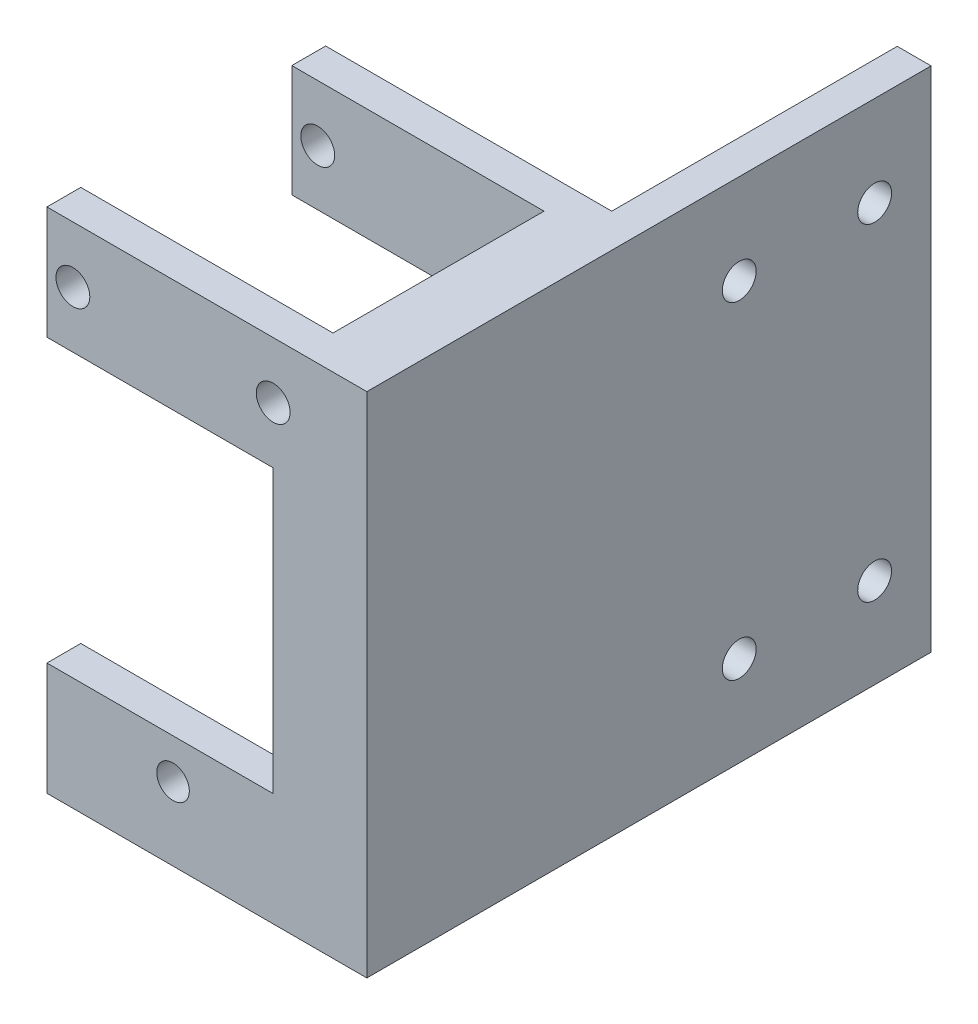
ISO-10303-21;
HEADER;
FILE_DESCRIPTION(('STEP AP214'),'2;1');
FILE_NAME('part.step','',(''),(''),'','','');
FILE_SCHEMA(('AUTOMOTIVE_DESIGN { 1 0 10303 214 1 1 1 1 }'));
ENDSEC;
DATA;
#1=APPLICATION_CONTEXT('core data for automotive mechanical design processes');
#2=APPLICATION_PROTOCOL_DEFINITION('international standard','automotive_design',2000,#1);
#3=PRODUCT_CONTEXT('',#1,'mechanical');
#4=PRODUCT('Part','Part','',(#3));
#5=PRODUCT_RELATED_PRODUCT_CATEGORY('part','',(#4));
#6=PRODUCT_DEFINITION_FORMATION('','',#4);
#7=PRODUCT_DEFINITION_CONTEXT('part definition',#1,'design');
#8=PRODUCT_DEFINITION('design','',#6,#7);
#9=PRODUCT_DEFINITION_SHAPE('','',#8);
#10=(LENGTH_UNIT() NAMED_UNIT(*) SI_UNIT(.MILLI.,.METRE.));
#11=(NAMED_UNIT(*) PLANE_ANGLE_UNIT() SI_UNIT($,.RADIAN.));
#12=(NAMED_UNIT(*) SI_UNIT($,.STERADIAN.) SOLID_ANGLE_UNIT());
#13=UNCERTAINTY_MEASURE_WITH_UNIT(LENGTH_MEASURE(1.E-05),#10,'distance_accuracy_value','');
#14=(GEOMETRIC_REPRESENTATION_CONTEXT(3) GLOBAL_UNCERTAINTY_ASSIGNED_CONTEXT((#13)) GLOBAL_UNIT_ASSIGNED_CONTEXT((#10,
#11,#12)) REPRESENTATION_CONTEXT('',''));
#15=CARTESIAN_POINT('',(0.,0.,0.));
#16=DIRECTION('',(0.,0.,1.));
#17=DIRECTION('',(1.,0.,0.));
#18=AXIS2_PLACEMENT_3D('',#15,#16,#17);
#19=CARTESIAN_POINT('',(0.,-22.5,-3.));
#20=DIRECTION('',(0.,1.,0.));
#21=DIRECTION('',(-1.,0.,0.));
#22=AXIS2_PLACEMENT_3D('',#19,#20,#21);
#23=PLANE('',#22);
#24=DIRECTION('',(0.,0.,1.));
#25=VECTOR('',#24,1.);
#26=CARTESIAN_POINT('',(9.675,-22.5,-21.7));
#27=LINE('',#26,#25);
#28=CARTESIAN_POINT('',(9.675,-22.5,-21.7));
#29=VERTEX_POINT('',#28);
#30=CARTESIAN_POINT('',(9.675,-22.5,-3.));
#31=VERTEX_POINT('',#30);
#32=EDGE_CURVE('E64',#29,#31,#27,.T.);
#33=ORIENTED_EDGE('',*,*,#32,.F.);
#34=DIRECTION('',(1.,0.,0.));
#35=VECTOR('',#34,1.);
#36=CARTESIAN_POINT('',(15.675,-22.5,-21.7));
#37=LINE('',#36,#35);
#38=CARTESIAN_POINT('',(-12.675,-22.5,-21.7));
#39=VERTEX_POINT('',#38);
#40=EDGE_CURVE('E176',#39,#29,#37,.T.);
#41=ORIENTED_EDGE('',*,*,#40,.F.);
#42=DIRECTION('',(0.,0.,1.));
#43=VECTOR('',#42,1.);
#44=CARTESIAN_POINT('',(-12.675,-22.5,-26.7));
#45=LINE('',#44,#43);
#46=CARTESIAN_POINT('',(-12.675,-22.5,-24.7));
#47=VERTEX_POINT('',#46);
#48=EDGE_CURVE('E356',#47,#39,#45,.T.);
#49=ORIENTED_EDGE('',*,*,#48,.F.);
#50=DIRECTION('',(-1.,0.,0.));
#51=VECTOR('',#50,1.);
#52=CARTESIAN_POINT('',(15.675,-22.5,-24.7));
#53=LINE('',#52,#51);
#54=CARTESIAN_POINT('',(12.675,-22.5,-24.7));
#55=VERTEX_POINT('',#54);
#56=EDGE_CURVE('E197',#55,#47,#53,.T.);
#57=ORIENTED_EDGE('',*,*,#56,.F.);
#58=DIRECTION('',(0.,0.,-1.));
#59=VECTOR('',#58,1.);
#60=CARTESIAN_POINT('',(12.675,-22.5,0.));
#61=LINE('',#60,#59);
#62=CARTESIAN_POINT('',(12.675,-22.5,-50.));
#63=VERTEX_POINT('',#62);
#64=EDGE_CURVE('E200',#55,#63,#61,.T.);
#65=ORIENTED_EDGE('',*,*,#64,.T.);
#66=DIRECTION('',(-1.,0.,0.));
#67=VECTOR('',#66,1.);
#68=CARTESIAN_POINT('',(15.675,-22.5,-50.));
#69=LINE('',#68,#67);
#70=CARTESIAN_POINT('',(15.675,-22.5,-50.));
#71=VERTEX_POINT('',#70);
#72=EDGE_CURVE('E230',#71,#63,#69,.T.);
#73=ORIENTED_EDGE('',*,*,#72,.F.);
#74=DIRECTION('',(0.,0.,-1.));
#75=VECTOR('',#74,1.);
#76=CARTESIAN_POINT('',(15.675,-22.5,0.));
#77=LINE('',#76,#75);
#78=CARTESIAN_POINT('',(15.675,-22.5,0.));
#79=VERTEX_POINT('',#78);
#80=EDGE_CURVE('E215',#79,#71,#77,.T.);
#81=ORIENTED_EDGE('',*,*,#80,.F.);
#82=DIRECTION('',(-1.,0.,0.));
#83=VECTOR('',#82,1.);
#84=CARTESIAN_POINT('',(0.,-22.5,0.));
#85=LINE('',#84,#83);
#86=CARTESIAN_POINT('',(-12.675,-22.5,0.));
#87=VERTEX_POINT('',#86);
#88=EDGE_CURVE('E277',#79,#87,#85,.T.);
#89=ORIENTED_EDGE('',*,*,#88,.T.);
#90=DIRECTION('',(0.,0.,1.));
#91=VECTOR('',#90,1.);
#92=CARTESIAN_POINT('',(-12.675,-22.5,-3.));
#93=LINE('',#92,#91);
#94=CARTESIAN_POINT('',(-12.675,-22.5,-3.));
#95=VERTEX_POINT('',#94);
#96=EDGE_CURVE('E287',#95,#87,#93,.T.);
#97=ORIENTED_EDGE('',*,*,#96,.F.);
#98=DIRECTION('',(-1.,0.,0.));
#99=VECTOR('',#98,1.);
#100=CARTESIAN_POINT('',(0.,-22.5,-3.));
#101=LINE('',#100,#99);
#102=EDGE_CURVE('E178',#31,#95,#101,.T.);
#103=ORIENTED_EDGE('',*,*,#102,.F.);
#104=EDGE_LOOP('',(#33,#41,#49,#57,#65,#73,#81,#89,#97,#103));
#105=FACE_BOUND('',#104,.T.);
#106=ADVANCED_FACE('F47',(#105),#23,.F.);
#107=CARTESIAN_POINT('',(0.,22.5,-3.));
#108=DIRECTION('',(0.,1.,0.));
#109=DIRECTION('',(-1.,0.,0.));
#110=AXIS2_PLACEMENT_3D('',#107,#108,#109);
#111=PLANE('',#110);
#112=DIRECTION('',(-1.,0.,0.));
#113=VECTOR('',#112,1.);
#114=CARTESIAN_POINT('',(15.675,22.5,-24.7));
#115=LINE('',#114,#113);
#116=CARTESIAN_POINT('',(12.675,22.5,-24.7));
#117=VERTEX_POINT('',#116);
#118=CARTESIAN_POINT('',(-12.675,22.5,-24.7));
#119=VERTEX_POINT('',#118);
#120=EDGE_CURVE('E207',#117,#119,#115,.T.);
#121=ORIENTED_EDGE('',*,*,#120,.T.);
#122=DIRECTION('',(0.,0.,1.));
#123=VECTOR('',#122,1.);
#124=CARTESIAN_POINT('',(-12.675,22.5,-26.7));
#125=LINE('',#124,#123);
#126=CARTESIAN_POINT('',(-12.675,22.5,-21.7));
#127=VERTEX_POINT('',#126);
#128=EDGE_CURVE('E358',#119,#127,#125,.T.);
#129=ORIENTED_EDGE('',*,*,#128,.T.);
#130=DIRECTION('',(1.,0.,0.));
#131=VECTOR('',#130,1.);
#132=CARTESIAN_POINT('',(15.675,22.5,-21.7));
#133=LINE('',#132,#131);
#134=CARTESIAN_POINT('',(9.675,22.5,-21.7));
#135=VERTEX_POINT('',#134);
#136=EDGE_CURVE('E203',#127,#135,#133,.T.);
#137=ORIENTED_EDGE('',*,*,#136,.T.);
#138=DIRECTION('',(0.,0.,-1.));
#139=VECTOR('',#138,1.);
#140=CARTESIAN_POINT('',(9.675,22.5,-21.7));
#141=LINE('',#140,#139);
#142=CARTESIAN_POINT('',(9.675,22.5,-3.));
#143=VERTEX_POINT('',#142);
#144=EDGE_CURVE('E185',#143,#135,#141,.T.);
#145=ORIENTED_EDGE('',*,*,#144,.F.);
#146=DIRECTION('',(-1.,0.,0.));
#147=VECTOR('',#146,1.);
#148=CARTESIAN_POINT('',(0.,22.5,-3.));
#149=LINE('',#148,#147);
#150=CARTESIAN_POINT('',(-12.675,22.5,-3.));
#151=VERTEX_POINT('',#150);
#152=EDGE_CURVE('E234',#143,#151,#149,.T.);
#153=ORIENTED_EDGE('',*,*,#152,.T.);
#154=DIRECTION('',(0.,0.,1.));
#155=VECTOR('',#154,1.);
#156=CARTESIAN_POINT('',(-12.675,22.5,-3.));
#157=LINE('',#156,#155);
#158=CARTESIAN_POINT('',(-12.675,22.5,0.));
#159=VERTEX_POINT('',#158);
#160=EDGE_CURVE('E260',#151,#159,#157,.T.);
#161=ORIENTED_EDGE('',*,*,#160,.T.);
#162=DIRECTION('',(-1.,0.,0.));
#163=VECTOR('',#162,1.);
#164=CARTESIAN_POINT('',(0.,22.5,0.));
#165=LINE('',#164,#163);
#166=CARTESIAN_POINT('',(15.675,22.5,0.));
#167=VERTEX_POINT('',#166);
#168=EDGE_CURVE('E233',#167,#159,#165,.T.);
#169=ORIENTED_EDGE('',*,*,#168,.F.);
#170=DIRECTION('',(0.,0.,1.));
#171=VECTOR('',#170,1.);
#172=CARTESIAN_POINT('',(15.675,22.5,0.));
#173=LINE('',#172,#171);
#174=CARTESIAN_POINT('',(15.675,22.5,-50.));
#175=VERTEX_POINT('',#174);
#176=EDGE_CURVE('E220',#175,#167,#173,.T.);
#177=ORIENTED_EDGE('',*,*,#176,.F.);
#178=DIRECTION('',(-1.,0.,0.));
#179=VECTOR('',#178,1.);
#180=CARTESIAN_POINT('',(15.675,22.5,-50.));
#181=LINE('',#180,#179);
#182=CARTESIAN_POINT('',(12.675,22.5,-50.));
#183=VERTEX_POINT('',#182);
#184=EDGE_CURVE('E222',#175,#183,#181,.T.);
#185=ORIENTED_EDGE('',*,*,#184,.T.);
#186=DIRECTION('',(0.,0.,1.));
#187=VECTOR('',#186,1.);
#188=CARTESIAN_POINT('',(12.675,22.5,0.));
#189=LINE('',#188,#187);
#190=EDGE_CURVE('E216',#183,#117,#189,.T.);
#191=ORIENTED_EDGE('',*,*,#190,.T.);
#192=EDGE_LOOP('',(#121,#129,#137,#145,#153,#161,#169,#177,#185,#191));
#193=FACE_BOUND('',#192,.T.);
#194=ADVANCED_FACE('F49',(#193),#111,.T.);
#195=CARTESIAN_POINT('',(15.675,-22.5,-21.7));
#196=DIRECTION('',(0.,0.,1.));
#197=DIRECTION('',(1.,0.,0.));
#198=AXIS2_PLACEMENT_3D('',#195,#196,#197);
#199=PLANE('',#198);
#200=DIRECTION('',(0.,-1.,0.));
#201=VECTOR('',#200,1.);
#202=CARTESIAN_POINT('',(9.675,22.5,-21.7));
#203=LINE('',#202,#201);
#204=EDGE_CURVE('E180',#135,#29,#203,.T.);
#205=ORIENTED_EDGE('',*,*,#204,.F.);
#206=ORIENTED_EDGE('',*,*,#136,.F.);
#207=DIRECTION('',(0.,-1.,0.));
#208=VECTOR('',#207,1.);
#209=CARTESIAN_POINT('',(-12.675,0.,-21.7));
#210=LINE('',#209,#208);
#211=CARTESIAN_POINT('',(-12.675,12.5728024085996,-21.7));
#212=VERTEX_POINT('',#211);
#213=EDGE_CURVE('E350',#127,#212,#210,.T.);
#214=ORIENTED_EDGE('',*,*,#213,.T.);
#215=DIRECTION('',(1.,0.,0.));
#216=VECTOR('',#215,1.);
#217=CARTESIAN_POINT('',(0.,12.5728024085996,-21.7));
#218=LINE('',#217,#216);
#219=CARTESIAN_POINT('',(7.37500000000001,12.5728024085996,-21.7));
#220=VERTEX_POINT('',#219);
#221=EDGE_CURVE('E347',#212,#220,#218,.T.);
#222=ORIENTED_EDGE('',*,*,#221,.T.);
#223=DIRECTION('',(0.,1.,0.));
#224=VECTOR('',#223,1.);
#225=CARTESIAN_POINT('',(7.37500000000001,0.,-21.7));
#226=LINE('',#225,#224);
#227=CARTESIAN_POINT('',(7.37500000000001,-12.5,-21.7));
#228=VERTEX_POINT('',#227);
#229=EDGE_CURVE('E345',#228,#220,#226,.T.);
#230=ORIENTED_EDGE('',*,*,#229,.F.);
#231=DIRECTION('',(1.,0.,0.));
#232=VECTOR('',#231,1.);
#233=CARTESIAN_POINT('',(0.,-12.5,-21.7));
#234=LINE('',#233,#232);
#235=CARTESIAN_POINT('',(-12.675,-12.5,-21.7));
#236=VERTEX_POINT('',#235);
#237=EDGE_CURVE('E319',#236,#228,#234,.T.);
#238=ORIENTED_EDGE('',*,*,#237,.F.);
#239=DIRECTION('',(0.,-1.,0.));
#240=VECTOR('',#239,1.);
#241=CARTESIAN_POINT('',(-12.675,0.,-21.7));
#242=LINE('',#241,#240);
#243=EDGE_CURVE('E195',#236,#39,#242,.T.);
#244=ORIENTED_EDGE('',*,*,#243,.T.);
#245=ORIENTED_EDGE('',*,*,#40,.T.);
#246=EDGE_LOOP('',(#205,#206,#214,#222,#230,#238,#244,#245));
#247=FACE_BOUND('',#246,.T.);
#248=CARTESIAN_POINT('',(-10.375,17.5,-21.7));
#249=DIRECTION('',(0.,0.,1.));
#250=DIRECTION('',(1.,0.,0.));
#251=AXIS2_PLACEMENT_3D('',#248,#249,#250);
#252=CIRCLE('',#251,1.5);
#253=CARTESIAN_POINT('',(-8.875,17.5,-21.7));
#254=VERTEX_POINT('',#253);
#255=EDGE_CURVE('E313',#254,#254,#252,.T.);
#256=ORIENTED_EDGE('',*,*,#255,.F.);
#257=EDGE_LOOP('',(#256));
#258=FACE_BOUND('',#257,.T.);
#259=CARTESIAN_POINT('',(7.375,17.5,-21.7));
#260=DIRECTION('',(0.,0.,1.));
#261=DIRECTION('',(1.,0.,0.));
#262=AXIS2_PLACEMENT_3D('',#259,#260,#261);
#263=CIRCLE('',#262,1.5);
#264=CARTESIAN_POINT('',(8.875,17.5,-21.7));
#265=VERTEX_POINT('',#264);
#266=EDGE_CURVE('E335',#265,#265,#263,.T.);
#267=ORIENTED_EDGE('',*,*,#266,.F.);
#268=EDGE_LOOP('',(#267));
#269=FACE_BOUND('',#268,.T.);
#270=CARTESIAN_POINT('',(-1.49999999999965,-16.0249999999999,-21.7));
#271=DIRECTION('',(0.,0.,1.));
#272=DIRECTION('',(1.,0.,0.));
#273=AXIS2_PLACEMENT_3D('',#270,#271,#272);
#274=CIRCLE('',#273,1.45);
#275=CARTESIAN_POINT('',(-0.0499999999996545,-16.0249999999999,-21.7));
#276=VERTEX_POINT('',#275);
#277=EDGE_CURVE('E331',#276,#276,#274,.T.);
#278=ORIENTED_EDGE('',*,*,#277,.F.);
#279=EDGE_LOOP('',(#278));
#280=FACE_BOUND('',#279,.T.);
#281=ADVANCED_FACE('F191',(#247,#258,#269,#280),#199,.T.);
#282=CARTESIAN_POINT('',(15.675,-22.5,-24.7));
#283=DIRECTION('',(0.,0.,-1.));
#284=DIRECTION('',(-1.,0.,0.));
#285=AXIS2_PLACEMENT_3D('',#282,#283,#284);
#286=PLANE('',#285);
#287=CARTESIAN_POINT('',(-10.375,17.5,-24.7));
#288=DIRECTION('',(0.,0.,-1.));
#289=DIRECTION('',(-1.,0.,0.));
#290=AXIS2_PLACEMENT_3D('',#287,#288,#289);
#291=CIRCLE('',#290,1.5);
#292=CARTESIAN_POINT('',(-11.875,17.5,-24.7));
#293=VERTEX_POINT('',#292);
#294=EDGE_CURVE('E316',#293,#293,#291,.T.);
#295=ORIENTED_EDGE('',*,*,#294,.F.);
#296=EDGE_LOOP('',(#295));
#297=FACE_BOUND('',#296,.T.);
#298=CARTESIAN_POINT('',(7.375,17.5,-24.7));
#299=DIRECTION('',(0.,0.,-1.));
#300=DIRECTION('',(-1.,0.,0.));
#301=AXIS2_PLACEMENT_3D('',#298,#299,#300);
#302=CIRCLE('',#301,1.5);
#303=CARTESIAN_POINT('',(5.875,17.5,-24.7));
#304=VERTEX_POINT('',#303);
#305=EDGE_CURVE('E312',#304,#304,#302,.T.);
#306=ORIENTED_EDGE('',*,*,#305,.F.);
#307=EDGE_LOOP('',(#306));
#308=FACE_BOUND('',#307,.T.);
#309=CARTESIAN_POINT('',(-1.49999999999965,-16.0249999999999,-24.7));
#310=DIRECTION('',(0.,0.,-1.));
#311=DIRECTION('',(-1.,0.,0.));
#312=AXIS2_PLACEMENT_3D('',#309,#310,#311);
#313=CIRCLE('',#312,1.45);
#314=CARTESIAN_POINT('',(-2.94999999999965,-16.0249999999999,-24.7));
#315=VERTEX_POINT('',#314);
#316=EDGE_CURVE('E309',#315,#315,#313,.T.);
#317=ORIENTED_EDGE('',*,*,#316,.F.);
#318=EDGE_LOOP('',(#317));
#319=FACE_BOUND('',#318,.T.);
#320=ORIENTED_EDGE('',*,*,#56,.T.);
#321=DIRECTION('',(0.,1.,0.));
#322=VECTOR('',#321,1.);
#323=CARTESIAN_POINT('',(-12.675,-22.5,-24.7));
#324=LINE('',#323,#322);
#325=CARTESIAN_POINT('',(-12.675,-12.5,-24.7));
#326=VERTEX_POINT('',#325);
#327=EDGE_CURVE('E11',#47,#326,#324,.T.);
#328=ORIENTED_EDGE('',*,*,#327,.T.);
#329=DIRECTION('',(-1.,0.,0.));
#330=VECTOR('',#329,1.);
#331=CARTESIAN_POINT('',(15.675,-12.5,-24.7));
#332=LINE('',#331,#330);
#333=CARTESIAN_POINT('',(7.37500000000001,-12.5,-24.7));
#334=VERTEX_POINT('',#333);
#335=EDGE_CURVE('E56',#334,#326,#332,.T.);
#336=ORIENTED_EDGE('',*,*,#335,.F.);
#337=DIRECTION('',(0.,-1.,0.));
#338=VECTOR('',#337,1.);
#339=CARTESIAN_POINT('',(7.37500000000001,-22.5,-24.7));
#340=LINE('',#339,#338);
#341=CARTESIAN_POINT('',(7.37500000000001,12.5728024085996,-24.7));
#342=VERTEX_POINT('',#341);
#343=EDGE_CURVE('E290',#342,#334,#340,.T.);
#344=ORIENTED_EDGE('',*,*,#343,.F.);
#345=DIRECTION('',(-1.,0.,0.));
#346=VECTOR('',#345,1.);
#347=CARTESIAN_POINT('',(15.675,12.5728024085996,-24.7));
#348=LINE('',#347,#346);
#349=CARTESIAN_POINT('',(-12.675,12.5728024085996,-24.7));
#350=VERTEX_POINT('',#349);
#351=EDGE_CURVE('E302',#342,#350,#348,.T.);
#352=ORIENTED_EDGE('',*,*,#351,.T.);
#353=DIRECTION('',(0.,1.,0.));
#354=VECTOR('',#353,1.);
#355=CARTESIAN_POINT('',(-12.675,-22.5,-24.7));
#356=LINE('',#355,#354);
#357=EDGE_CURVE('E305',#350,#119,#356,.T.);
#358=ORIENTED_EDGE('',*,*,#357,.T.);
#359=ORIENTED_EDGE('',*,*,#120,.F.);
#360=DIRECTION('',(0.,1.,0.));
#361=VECTOR('',#360,1.);
#362=CARTESIAN_POINT('',(12.675,0.,-24.7));
#363=LINE('',#362,#361);
#364=EDGE_CURVE('E196',#55,#117,#363,.T.);
#365=ORIENTED_EDGE('',*,*,#364,.F.);
#366=EDGE_LOOP('',(#320,#328,#336,#344,#352,#358,#359,#365));
#367=FACE_BOUND('',#366,.T.);
#368=ADVANCED_FACE('F376',(#297,#308,#319,#367),#286,.T.);
#369=CARTESIAN_POINT('',(-12.675,0.,-3.));
#370=DIRECTION('',(1.,0.,0.));
#371=DIRECTION('',(0.,0.,-1.));
#372=AXIS2_PLACEMENT_3D('',#369,#370,#371);
#373=PLANE('',#372);
#374=DIRECTION('',(0.,1.,0.));
#375=VECTOR('',#374,1.);
#376=CARTESIAN_POINT('',(-12.675,0.,0.));
#377=LINE('',#376,#375);
#378=CARTESIAN_POINT('',(-12.675,-12.5,0.));
#379=VERTEX_POINT('',#378);
#380=EDGE_CURVE('E275',#87,#379,#377,.T.);
#381=ORIENTED_EDGE('',*,*,#380,.T.);
#382=DIRECTION('',(0.,0.,1.));
#383=VECTOR('',#382,1.);
#384=CARTESIAN_POINT('',(-12.675,-12.5,-3.));
#385=LINE('',#384,#383);
#386=CARTESIAN_POINT('',(-12.675,-12.5,-3.));
#387=VERTEX_POINT('',#386);
#388=EDGE_CURVE('E291',#387,#379,#385,.T.);
#389=ORIENTED_EDGE('',*,*,#388,.F.);
#390=DIRECTION('',(0.,1.,0.));
#391=VECTOR('',#390,1.);
#392=CARTESIAN_POINT('',(-12.675,0.,-3.));
#393=LINE('',#392,#391);
#394=EDGE_CURVE('E248',#95,#387,#393,.T.);
#395=ORIENTED_EDGE('',*,*,#394,.F.);
#396=ORIENTED_EDGE('',*,*,#96,.T.);
#397=EDGE_LOOP('',(#381,#389,#395,#396));
#398=FACE_BOUND('',#397,.T.);
#399=ADVANCED_FACE('F405',(#398),#373,.F.);
#400=CARTESIAN_POINT('',(0.,-12.5,-3.));
#401=DIRECTION('',(0.,-1.,0.));
#402=DIRECTION('',(0.,0.,-1.));
#403=AXIS2_PLACEMENT_3D('',#400,#401,#402);
#404=PLANE('',#403);
#405=DIRECTION('',(1.,0.,0.));
#406=VECTOR('',#405,1.);
#407=CARTESIAN_POINT('',(0.,-12.5,0.));
#408=LINE('',#407,#406);
#409=CARTESIAN_POINT('',(7.37500000000001,-12.5,0.));
#410=VERTEX_POINT('',#409);
#411=EDGE_CURVE('E272',#379,#410,#408,.T.);
#412=ORIENTED_EDGE('',*,*,#411,.T.);
#413=DIRECTION('',(0.,0.,1.));
#414=VECTOR('',#413,1.);
#415=CARTESIAN_POINT('',(7.37500000000001,-12.5,-3.));
#416=LINE('',#415,#414);
#417=CARTESIAN_POINT('',(7.37500000000001,-12.5,-3.));
#418=VERTEX_POINT('',#417);
#419=EDGE_CURVE('E294',#418,#410,#416,.T.);
#420=ORIENTED_EDGE('',*,*,#419,.F.);
#421=DIRECTION('',(1.,0.,0.));
#422=VECTOR('',#421,1.);
#423=CARTESIAN_POINT('',(0.,-12.5,-3.));
#424=LINE('',#423,#422);
#425=EDGE_CURVE('E246',#387,#418,#424,.T.);
#426=ORIENTED_EDGE('',*,*,#425,.F.);
#427=ORIENTED_EDGE('',*,*,#388,.T.);
#428=EDGE_LOOP('',(#412,#420,#426,#427));
#429=FACE_BOUND('',#428,.T.);
#430=ADVANCED_FACE('F409',(#429),#404,.F.);
#431=CARTESIAN_POINT('',(7.375,0.,-3.));
#432=DIRECTION('',(-1.,0.,0.));
#433=DIRECTION('',(0.,-1.,0.));
#434=AXIS2_PLACEMENT_3D('',#431,#432,#433);
#435=PLANE('',#434);
#436=DIRECTION('',(0.,-1.,0.));
#437=VECTOR('',#436,1.);
#438=CARTESIAN_POINT('',(7.375,0.,0.));
#439=LINE('',#438,#437);
#440=CARTESIAN_POINT('',(7.375,12.5,0.));
#441=VERTEX_POINT('',#440);
#442=EDGE_CURVE('E269',#441,#410,#439,.T.);
#443=ORIENTED_EDGE('',*,*,#442,.F.);
#444=DIRECTION('',(0.,0.,1.));
#445=VECTOR('',#444,1.);
#446=CARTESIAN_POINT('',(7.375,12.5,-3.));
#447=LINE('',#446,#445);
#448=CARTESIAN_POINT('',(7.375,12.5,-3.));
#449=VERTEX_POINT('',#448);
#450=EDGE_CURVE('E296',#449,#441,#447,.T.);
#451=ORIENTED_EDGE('',*,*,#450,.F.);
#452=DIRECTION('',(0.,-1.,0.));
#453=VECTOR('',#452,1.);
#454=CARTESIAN_POINT('',(7.375,0.,-3.));
#455=LINE('',#454,#453);
#456=EDGE_CURVE('E243',#449,#418,#455,.T.);
#457=ORIENTED_EDGE('',*,*,#456,.T.);
#458=ORIENTED_EDGE('',*,*,#419,.T.);
#459=EDGE_LOOP('',(#443,#451,#457,#458));
#460=FACE_BOUND('',#459,.T.);
#461=ADVANCED_FACE('F468',(#460),#435,.T.);
#462=CARTESIAN_POINT('',(0.,12.5,-3.));
#463=DIRECTION('',(0.,-1.,0.));
#464=DIRECTION('',(0.,0.,-1.));
#465=AXIS2_PLACEMENT_3D('',#462,#463,#464);
#466=PLANE('',#465);
#467=DIRECTION('',(1.,0.,0.));
#468=VECTOR('',#467,1.);
#469=CARTESIAN_POINT('',(0.,12.5,0.));
#470=LINE('',#469,#468);
#471=CARTESIAN_POINT('',(-12.675,12.5,0.));
#472=VERTEX_POINT('',#471);
#473=EDGE_CURVE('E266',#472,#441,#470,.T.);
#474=ORIENTED_EDGE('',*,*,#473,.F.);
#475=DIRECTION('',(0.,0.,1.));
#476=VECTOR('',#475,1.);
#477=CARTESIAN_POINT('',(-12.675,12.5,-3.));
#478=LINE('',#477,#476);
#479=CARTESIAN_POINT('',(-12.675,12.5,-3.));
#480=VERTEX_POINT('',#479);
#481=EDGE_CURVE('E298',#480,#472,#478,.T.);
#482=ORIENTED_EDGE('',*,*,#481,.F.);
#483=DIRECTION('',(1.,0.,0.));
#484=VECTOR('',#483,1.);
#485=CARTESIAN_POINT('',(0.,12.5,-3.));
#486=LINE('',#485,#484);
#487=EDGE_CURVE('E240',#480,#449,#486,.T.);
#488=ORIENTED_EDGE('',*,*,#487,.T.);
#489=ORIENTED_EDGE('',*,*,#450,.T.);
#490=EDGE_LOOP('',(#474,#482,#488,#489));
#491=FACE_BOUND('',#490,.T.);
#492=ADVANCED_FACE('F471',(#491),#466,.T.);
#493=CARTESIAN_POINT('',(-12.675,0.,-3.));
#494=DIRECTION('',(1.,0.,0.));
#495=DIRECTION('',(0.,0.,-1.));
#496=AXIS2_PLACEMENT_3D('',#493,#494,#495);
#497=PLANE('',#496);
#498=DIRECTION('',(0.,1.,0.));
#499=VECTOR('',#498,1.);
#500=CARTESIAN_POINT('',(-12.675,0.,0.));
#501=LINE('',#500,#499);
#502=EDGE_CURVE('E263',#472,#159,#501,.T.);
#503=ORIENTED_EDGE('',*,*,#502,.T.);
#504=ORIENTED_EDGE('',*,*,#160,.F.);
#505=DIRECTION('',(0.,1.,0.));
#506=VECTOR('',#505,1.);
#507=CARTESIAN_POINT('',(-12.675,0.,-3.));
#508=LINE('',#507,#506);
#509=EDGE_CURVE('E236',#480,#151,#508,.T.);
#510=ORIENTED_EDGE('',*,*,#509,.F.);
#511=ORIENTED_EDGE('',*,*,#481,.T.);
#512=EDGE_LOOP('',(#503,#504,#510,#511));
#513=FACE_BOUND('',#512,.T.);
#514=ADVANCED_FACE('F474',(#513),#497,.F.);
#515=CARTESIAN_POINT('',(7.375,17.5,-3.));
#516=DIRECTION('',(0.,0.,1.));
#517=DIRECTION('',(1.,0.,0.));
#518=AXIS2_PLACEMENT_3D('',#515,#516,#517);
#519=CYLINDRICAL_SURFACE('',#518,1.5);
#520=CARTESIAN_POINT('',(7.375,17.5,-3.));
#521=DIRECTION('',(0.,0.,1.));
#522=DIRECTION('',(1.,0.,0.));
#523=AXIS2_PLACEMENT_3D('',#520,#521,#522);
#524=CIRCLE('',#523,1.5);
#525=CARTESIAN_POINT('',(8.875,17.5,-3.));
#526=VERTEX_POINT('',#525);
#527=EDGE_CURVE('E254',#526,#526,#524,.T.);
#528=ORIENTED_EDGE('',*,*,#527,.F.);
#529=EDGE_LOOP('',(#528));
#530=FACE_BOUND('',#529,.T.);
#531=CARTESIAN_POINT('',(7.375,17.5,0.));
#532=DIRECTION('',(0.,0.,1.));
#533=DIRECTION('',(1.,0.,0.));
#534=AXIS2_PLACEMENT_3D('',#531,#532,#533);
#535=CIRCLE('',#534,1.5);
#536=CARTESIAN_POINT('',(8.875,17.5,0.));
#537=VERTEX_POINT('',#536);
#538=EDGE_CURVE('E282',#537,#537,#535,.T.);
#539=ORIENTED_EDGE('',*,*,#538,.T.);
#540=EDGE_LOOP('',(#539));
#541=FACE_BOUND('',#540,.T.);
#542=ADVANCED_FACE('F477',(#530,#541),#519,.F.);
#543=CARTESIAN_POINT('',(-1.49999999999965,-16.0249999999999,-3.));
#544=DIRECTION('',(0.,0.,1.));
#545=DIRECTION('',(1.,0.,0.));
#546=AXIS2_PLACEMENT_3D('',#543,#544,#545);
#547=CYLINDRICAL_SURFACE('',#546,1.445);
#548=CARTESIAN_POINT('',(-1.49999999999965,-16.0249999999999,-3.));
#549=DIRECTION('',(0.,0.,1.));
#550=DIRECTION('',(1.,0.,0.));
#551=AXIS2_PLACEMENT_3D('',#548,#549,#550);
#552=CIRCLE('',#551,1.445);
#553=CARTESIAN_POINT('',(-0.0549999999996539,-16.0249999999999,-3.));
#554=VERTEX_POINT('',#553);
#555=EDGE_CURVE('E251',#554,#554,#552,.T.);
#556=ORIENTED_EDGE('',*,*,#555,.F.);
#557=EDGE_LOOP('',(#556));
#558=FACE_BOUND('',#557,.T.);
#559=CARTESIAN_POINT('',(-1.49999999999965,-16.0249999999999,0.));
#560=DIRECTION('',(0.,0.,1.));
#561=DIRECTION('',(1.,0.,0.));
#562=AXIS2_PLACEMENT_3D('',#559,#560,#561);
#563=CIRCLE('',#562,1.445);
#564=CARTESIAN_POINT('',(-0.0549999999996539,-16.0249999999999,0.));
#565=VERTEX_POINT('',#564);
#566=EDGE_CURVE('E279',#565,#565,#563,.T.);
#567=ORIENTED_EDGE('',*,*,#566,.T.);
#568=EDGE_LOOP('',(#567));
#569=FACE_BOUND('',#568,.T.);
#570=ADVANCED_FACE('F462',(#558,#569),#547,.F.);
#571=CARTESIAN_POINT('',(-10.375,17.5,-3.));
#572=DIRECTION('',(0.,0.,1.));
#573=DIRECTION('',(1.,0.,0.));
#574=AXIS2_PLACEMENT_3D('',#571,#572,#573);
#575=CYLINDRICAL_SURFACE('',#574,1.5);
#576=CARTESIAN_POINT('',(-10.375,17.5,-3.));
#577=DIRECTION('',(0.,0.,1.));
#578=DIRECTION('',(1.,0.,0.));
#579=AXIS2_PLACEMENT_3D('',#576,#577,#578);
#580=CIRCLE('',#579,1.5);
#581=CARTESIAN_POINT('',(-8.875,17.5,-3.));
#582=VERTEX_POINT('',#581);
#583=EDGE_CURVE('E257',#582,#582,#580,.T.);
#584=ORIENTED_EDGE('',*,*,#583,.F.);
#585=EDGE_LOOP('',(#584));
#586=FACE_BOUND('',#585,.T.);
#587=CARTESIAN_POINT('',(-10.375,17.5,0.));
#588=DIRECTION('',(0.,0.,1.));
#589=DIRECTION('',(1.,0.,0.));
#590=AXIS2_PLACEMENT_3D('',#587,#588,#589);
#591=CIRCLE('',#590,1.5);
#592=CARTESIAN_POINT('',(-8.875,17.5,0.));
#593=VERTEX_POINT('',#592);
#594=EDGE_CURVE('E237',#593,#593,#591,.T.);
#595=ORIENTED_EDGE('',*,*,#594,.T.);
#596=EDGE_LOOP('',(#595));
#597=FACE_BOUND('',#596,.T.);
#598=ADVANCED_FACE('F515',(#586,#597),#575,.F.);
#599=CARTESIAN_POINT('',(0.,0.,-3.));
#600=DIRECTION('',(0.,0.,1.));
#601=DIRECTION('',(1.,0.,0.));
#602=AXIS2_PLACEMENT_3D('',#599,#600,#601);
#603=PLANE('',#602);
#604=ORIENTED_EDGE('',*,*,#152,.F.);
#605=DIRECTION('',(0.,1.,0.));
#606=VECTOR('',#605,1.);
#607=CARTESIAN_POINT('',(9.675,22.5,-3.));
#608=LINE('',#607,#606);
#609=EDGE_CURVE('E179',#31,#143,#608,.T.);
#610=ORIENTED_EDGE('',*,*,#609,.F.);
#611=ORIENTED_EDGE('',*,*,#102,.T.);
#612=ORIENTED_EDGE('',*,*,#394,.T.);
#613=ORIENTED_EDGE('',*,*,#425,.T.);
#614=ORIENTED_EDGE('',*,*,#456,.F.);
#615=ORIENTED_EDGE('',*,*,#487,.F.);
#616=ORIENTED_EDGE('',*,*,#509,.T.);
#617=EDGE_LOOP('',(#604,#610,#611,#612,#613,#614,#615,#616));
#618=FACE_BOUND('',#617,.T.);
#619=ORIENTED_EDGE('',*,*,#555,.T.);
#620=EDGE_LOOP('',(#619));
#621=FACE_BOUND('',#620,.T.);
#622=ORIENTED_EDGE('',*,*,#527,.T.);
#623=EDGE_LOOP('',(#622));
#624=FACE_BOUND('',#623,.T.);
#625=ORIENTED_EDGE('',*,*,#583,.T.);
#626=EDGE_LOOP('',(#625));
#627=FACE_BOUND('',#626,.T.);
#628=ADVANCED_FACE('F414',(#618,#621,#624,#627),#603,.F.);
#629=CARTESIAN_POINT('',(0.,0.,0.));
#630=DIRECTION('',(0.,0.,1.));
#631=DIRECTION('',(1.,0.,0.));
#632=AXIS2_PLACEMENT_3D('',#629,#630,#631);
#633=PLANE('',#632);
#634=ORIENTED_EDGE('',*,*,#88,.F.);
#635=DIRECTION('',(0.,-1.,0.));
#636=VECTOR('',#635,1.);
#637=CARTESIAN_POINT('',(15.675,22.5,0.));
#638=LINE('',#637,#636);
#639=EDGE_CURVE('E212',#167,#79,#638,.T.);
#640=ORIENTED_EDGE('',*,*,#639,.F.);
#641=ORIENTED_EDGE('',*,*,#168,.T.);
#642=ORIENTED_EDGE('',*,*,#502,.F.);
#643=ORIENTED_EDGE('',*,*,#473,.T.);
#644=ORIENTED_EDGE('',*,*,#442,.T.);
#645=ORIENTED_EDGE('',*,*,#411,.F.);
#646=ORIENTED_EDGE('',*,*,#380,.F.);
#647=EDGE_LOOP('',(#634,#640,#641,#642,#643,#644,#645,#646));
#648=FACE_BOUND('',#647,.T.);
#649=ORIENTED_EDGE('',*,*,#566,.F.);
#650=EDGE_LOOP('',(#649));
#651=FACE_BOUND('',#650,.T.);
#652=ORIENTED_EDGE('',*,*,#538,.F.);
#653=EDGE_LOOP('',(#652));
#654=FACE_BOUND('',#653,.T.);
#655=ORIENTED_EDGE('',*,*,#594,.F.);
#656=EDGE_LOOP('',(#655));
#657=FACE_BOUND('',#656,.T.);
#658=ADVANCED_FACE('F398',(#648,#651,#654,#657),#633,.T.);
#659=CARTESIAN_POINT('',(12.675,0.,0.));
#660=DIRECTION('',(1.,0.,0.));
#661=DIRECTION('',(0.,0.,-1.));
#662=AXIS2_PLACEMENT_3D('',#659,#660,#661);
#663=PLANE('',#662);
#664=CARTESIAN_POINT('',(12.675,-14.5,-33.));
#665=DIRECTION('',(-1.,0.,0.));
#666=DIRECTION('',(0.,0.,1.));
#667=AXIS2_PLACEMENT_3D('',#664,#665,#666);
#668=CIRCLE('',#667,1.5);
#669=CARTESIAN_POINT('',(12.675,-14.5,-31.5));
#670=VERTEX_POINT('',#669);
#671=EDGE_CURVE('E424',#670,#670,#668,.T.);
#672=ORIENTED_EDGE('',*,*,#671,.F.);
#673=EDGE_LOOP('',(#672));
#674=FACE_BOUND('',#673,.T.);
#675=CARTESIAN_POINT('',(12.675,14.5,-45.));
#676=DIRECTION('',(-1.,0.,0.));
#677=DIRECTION('',(0.,0.,1.));
#678=AXIS2_PLACEMENT_3D('',#675,#676,#677);
#679=CIRCLE('',#678,1.5);
#680=CARTESIAN_POINT('',(12.675,14.5,-43.5));
#681=VERTEX_POINT('',#680);
#682=EDGE_CURVE('E423',#681,#681,#679,.T.);
#683=ORIENTED_EDGE('',*,*,#682,.F.);
#684=EDGE_LOOP('',(#683));
#685=FACE_BOUND('',#684,.T.);
#686=CARTESIAN_POINT('',(12.675,-14.5,-45.));
#687=DIRECTION('',(-1.,0.,0.));
#688=DIRECTION('',(0.,0.,1.));
#689=AXIS2_PLACEMENT_3D('',#686,#687,#688);
#690=CIRCLE('',#689,1.5);
#691=CARTESIAN_POINT('',(12.675,-14.5,-43.5));
#692=VERTEX_POINT('',#691);
#693=EDGE_CURVE('E418',#692,#692,#690,.T.);
#694=ORIENTED_EDGE('',*,*,#693,.F.);
#695=EDGE_LOOP('',(#694));
#696=FACE_BOUND('',#695,.T.);
#697=CARTESIAN_POINT('',(12.675,14.5,-33.));
#698=DIRECTION('',(-1.,0.,0.));
#699=DIRECTION('',(0.,0.,1.));
#700=AXIS2_PLACEMENT_3D('',#697,#698,#699);
#701=CIRCLE('',#700,1.5);
#702=CARTESIAN_POINT('',(12.675,14.5,-31.5));
#703=VERTEX_POINT('',#702);
#704=EDGE_CURVE('E324',#703,#703,#701,.T.);
#705=ORIENTED_EDGE('',*,*,#704,.F.);
#706=EDGE_LOOP('',(#705));
#707=FACE_BOUND('',#706,.T.);
#708=ORIENTED_EDGE('',*,*,#64,.F.);
#709=ORIENTED_EDGE('',*,*,#364,.T.);
#710=ORIENTED_EDGE('',*,*,#190,.F.);
#711=DIRECTION('',(0.,1.,0.));
#712=VECTOR('',#711,1.);
#713=CARTESIAN_POINT('',(12.675,22.5,-50.));
#714=LINE('',#713,#712);
#715=EDGE_CURVE('E224',#63,#183,#714,.T.);
#716=ORIENTED_EDGE('',*,*,#715,.F.);
#717=EDGE_LOOP('',(#708,#709,#710,#716));
#718=FACE_BOUND('',#717,.T.);
#719=ADVANCED_FACE('F383',(#674,#685,#696,#707,#718),#663,.F.);
#720=CARTESIAN_POINT('',(15.675,22.5,-50.));
#721=DIRECTION('',(0.,0.,1.));
#722=DIRECTION('',(1.,0.,0.));
#723=AXIS2_PLACEMENT_3D('',#720,#721,#722);
#724=PLANE('',#723);
#725=ORIENTED_EDGE('',*,*,#715,.T.);
#726=ORIENTED_EDGE('',*,*,#184,.F.);
#727=DIRECTION('',(0.,1.,0.));
#728=VECTOR('',#727,1.);
#729=CARTESIAN_POINT('',(15.675,22.5,-50.));
#730=LINE('',#729,#728);
#731=EDGE_CURVE('E218',#71,#175,#730,.T.);
#732=ORIENTED_EDGE('',*,*,#731,.F.);
#733=ORIENTED_EDGE('',*,*,#72,.T.);
#734=EDGE_LOOP('',(#725,#726,#732,#733));
#735=FACE_BOUND('',#734,.T.);
#736=ADVANCED_FACE('F391',(#735),#724,.F.);
#737=CARTESIAN_POINT('',(15.675,0.,0.));
#738=DIRECTION('',(1.,0.,0.));
#739=DIRECTION('',(0.,0.,-1.));
#740=AXIS2_PLACEMENT_3D('',#737,#738,#739);
#741=PLANE('',#740);
#742=CARTESIAN_POINT('',(15.675,-14.5,-33.));
#743=DIRECTION('',(1.,0.,0.));
#744=DIRECTION('',(0.,0.,-1.));
#745=AXIS2_PLACEMENT_3D('',#742,#743,#744);
#746=CIRCLE('',#745,1.5);
#747=CARTESIAN_POINT('',(15.675,-14.5,-34.5));
#748=VERTEX_POINT('',#747);
#749=EDGE_CURVE('E51',#748,#748,#746,.T.);
#750=ORIENTED_EDGE('',*,*,#749,.F.);
#751=EDGE_LOOP('',(#750));
#752=FACE_BOUND('',#751,.T.);
#753=CARTESIAN_POINT('',(15.675,14.5,-45.));
#754=DIRECTION('',(1.,0.,0.));
#755=DIRECTION('',(0.,0.,-1.));
#756=AXIS2_PLACEMENT_3D('',#753,#754,#755);
#757=CIRCLE('',#756,1.5);
#758=CARTESIAN_POINT('',(15.675,14.5,-46.5));
#759=VERTEX_POINT('',#758);
#760=EDGE_CURVE('E326',#759,#759,#757,.T.);
#761=ORIENTED_EDGE('',*,*,#760,.F.);
#762=EDGE_LOOP('',(#761));
#763=FACE_BOUND('',#762,.T.);
#764=CARTESIAN_POINT('',(15.675,-14.5,-45.));
#765=DIRECTION('',(1.,0.,0.));
#766=DIRECTION('',(0.,0.,-1.));
#767=AXIS2_PLACEMENT_3D('',#764,#765,#766);
#768=CIRCLE('',#767,1.5);
#769=CARTESIAN_POINT('',(15.675,-14.5,-46.5));
#770=VERTEX_POINT('',#769);
#771=EDGE_CURVE('E323',#770,#770,#768,.T.);
#772=ORIENTED_EDGE('',*,*,#771,.F.);
#773=EDGE_LOOP('',(#772));
#774=FACE_BOUND('',#773,.T.);
#775=CARTESIAN_POINT('',(15.675,14.5,-33.));
#776=DIRECTION('',(1.,0.,0.));
#777=DIRECTION('',(0.,0.,-1.));
#778=AXIS2_PLACEMENT_3D('',#775,#776,#777);
#779=CIRCLE('',#778,1.5);
#780=CARTESIAN_POINT('',(15.675,14.5,-34.5));
#781=VERTEX_POINT('',#780);
#782=EDGE_CURVE('E320',#781,#781,#779,.T.);
#783=ORIENTED_EDGE('',*,*,#782,.F.);
#784=EDGE_LOOP('',(#783));
#785=FACE_BOUND('',#784,.T.);
#786=ORIENTED_EDGE('',*,*,#176,.T.);
#787=ORIENTED_EDGE('',*,*,#639,.T.);
#788=ORIENTED_EDGE('',*,*,#80,.T.);
#789=ORIENTED_EDGE('',*,*,#731,.T.);
#790=EDGE_LOOP('',(#786,#787,#788,#789));
#791=FACE_BOUND('',#790,.T.);
#792=ADVANCED_FACE('F396',(#752,#763,#774,#785,#791),#741,.T.);
#793=CARTESIAN_POINT('',(0.,-12.5,-26.7));
#794=DIRECTION('',(0.,-1.,0.));
#795=DIRECTION('',(0.,0.,-1.));
#796=AXIS2_PLACEMENT_3D('',#793,#794,#795);
#797=PLANE('',#796);
#798=ORIENTED_EDGE('',*,*,#335,.T.);
#799=DIRECTION('',(0.,0.,1.));
#800=VECTOR('',#799,1.);
#801=CARTESIAN_POINT('',(-12.675,-12.5,-26.7));
#802=LINE('',#801,#800);
#803=EDGE_CURVE('E210',#326,#236,#802,.T.);
#804=ORIENTED_EDGE('',*,*,#803,.T.);
#805=ORIENTED_EDGE('',*,*,#237,.T.);
#806=DIRECTION('',(0.,0.,1.));
#807=VECTOR('',#806,1.);
#808=CARTESIAN_POINT('',(7.37500000000001,-12.5,-26.7));
#809=LINE('',#808,#807);
#810=EDGE_CURVE('E354',#334,#228,#809,.T.);
#811=ORIENTED_EDGE('',*,*,#810,.F.);
#812=EDGE_LOOP('',(#798,#804,#805,#811));
#813=FACE_BOUND('',#812,.T.);
#814=ADVANCED_FACE('F369',(#813),#797,.F.);
#815=CARTESIAN_POINT('',(-12.675,0.,-26.7));
#816=DIRECTION('',(-1.,0.,0.));
#817=DIRECTION('',(0.,-1.,0.));
#818=AXIS2_PLACEMENT_3D('',#815,#816,#817);
#819=PLANE('',#818);
#820=ORIENTED_EDGE('',*,*,#48,.T.);
#821=ORIENTED_EDGE('',*,*,#243,.F.);
#822=ORIENTED_EDGE('',*,*,#803,.F.);
#823=ORIENTED_EDGE('',*,*,#327,.F.);
#824=EDGE_LOOP('',(#820,#821,#822,#823));
#825=FACE_BOUND('',#824,.T.);
#826=ADVANCED_FACE('F378',(#825),#819,.T.);
#827=CARTESIAN_POINT('',(-12.675,0.,-26.7));
#828=DIRECTION('',(-1.,0.,0.));
#829=DIRECTION('',(0.,-1.,0.));
#830=AXIS2_PLACEMENT_3D('',#827,#828,#829);
#831=PLANE('',#830);
#832=DIRECTION('',(0.,0.,1.));
#833=VECTOR('',#832,1.);
#834=CARTESIAN_POINT('',(-12.675,12.5728024085996,-26.7));
#835=LINE('',#834,#833);
#836=EDGE_CURVE('E361',#350,#212,#835,.T.);
#837=ORIENTED_EDGE('',*,*,#836,.T.);
#838=ORIENTED_EDGE('',*,*,#213,.F.);
#839=ORIENTED_EDGE('',*,*,#128,.F.);
#840=ORIENTED_EDGE('',*,*,#357,.F.);
#841=EDGE_LOOP('',(#837,#838,#839,#840));
#842=FACE_BOUND('',#841,.T.);
#843=ADVANCED_FACE('F488',(#842),#831,.T.);
#844=CARTESIAN_POINT('',(0.,12.5728024085996,-26.7));
#845=DIRECTION('',(0.,-1.,0.));
#846=DIRECTION('',(0.,0.,-1.));
#847=AXIS2_PLACEMENT_3D('',#844,#845,#846);
#848=PLANE('',#847);
#849=DIRECTION('',(0.,0.,1.));
#850=VECTOR('',#849,1.);
#851=CARTESIAN_POINT('',(7.37500000000001,12.5728024085996,-26.7));
#852=LINE('',#851,#850);
#853=EDGE_CURVE('E72',#342,#220,#852,.T.);
#854=ORIENTED_EDGE('',*,*,#853,.T.);
#855=ORIENTED_EDGE('',*,*,#221,.F.);
#856=ORIENTED_EDGE('',*,*,#836,.F.);
#857=ORIENTED_EDGE('',*,*,#351,.F.);
#858=EDGE_LOOP('',(#854,#855,#856,#857));
#859=FACE_BOUND('',#858,.T.);
#860=ADVANCED_FACE('F374',(#859),#848,.T.);
#861=CARTESIAN_POINT('',(7.37500000000001,0.,-26.7));
#862=DIRECTION('',(1.,0.,0.));
#863=DIRECTION('',(0.,0.,-1.));
#864=AXIS2_PLACEMENT_3D('',#861,#862,#863);
#865=PLANE('',#864);
#866=ORIENTED_EDGE('',*,*,#343,.T.);
#867=ORIENTED_EDGE('',*,*,#810,.T.);
#868=ORIENTED_EDGE('',*,*,#229,.T.);
#869=ORIENTED_EDGE('',*,*,#853,.F.);
#870=EDGE_LOOP('',(#866,#867,#868,#869));
#871=FACE_BOUND('',#870,.T.);
#872=ADVANCED_FACE('F364',(#871),#865,.F.);
#873=CARTESIAN_POINT('',(-1.49999999999965,-16.0249999999999,-26.7));
#874=DIRECTION('',(0.,0.,1.));
#875=DIRECTION('',(1.,0.,0.));
#876=AXIS2_PLACEMENT_3D('',#873,#874,#875);
#877=CYLINDRICAL_SURFACE('',#876,1.45);
#878=ORIENTED_EDGE('',*,*,#316,.T.);
#879=EDGE_LOOP('',(#878));
#880=FACE_BOUND('',#879,.T.);
#881=ORIENTED_EDGE('',*,*,#277,.T.);
#882=EDGE_LOOP('',(#881));
#883=FACE_BOUND('',#882,.T.);
#884=ADVANCED_FACE('F442',(#880,#883),#877,.F.);
#885=CARTESIAN_POINT('',(7.375,17.5,-26.7));
#886=DIRECTION('',(0.,0.,1.));
#887=DIRECTION('',(1.,0.,0.));
#888=AXIS2_PLACEMENT_3D('',#885,#886,#887);
#889=CYLINDRICAL_SURFACE('',#888,1.5);
#890=ORIENTED_EDGE('',*,*,#305,.T.);
#891=EDGE_LOOP('',(#890));
#892=FACE_BOUND('',#891,.T.);
#893=ORIENTED_EDGE('',*,*,#266,.T.);
#894=EDGE_LOOP('',(#893));
#895=FACE_BOUND('',#894,.T.);
#896=ADVANCED_FACE('F440',(#892,#895),#889,.F.);
#897=CARTESIAN_POINT('',(-10.375,17.5,-26.7));
#898=DIRECTION('',(0.,0.,1.));
#899=DIRECTION('',(1.,0.,0.));
#900=AXIS2_PLACEMENT_3D('',#897,#898,#899);
#901=CYLINDRICAL_SURFACE('',#900,1.5);
#902=ORIENTED_EDGE('',*,*,#294,.T.);
#903=EDGE_LOOP('',(#902));
#904=FACE_BOUND('',#903,.T.);
#905=ORIENTED_EDGE('',*,*,#255,.T.);
#906=EDGE_LOOP('',(#905));
#907=FACE_BOUND('',#906,.T.);
#908=ADVANCED_FACE('F433',(#904,#907),#901,.F.);
#909=CARTESIAN_POINT('',(17.675,14.5,-33.));
#910=DIRECTION('',(-1.,0.,0.));
#911=DIRECTION('',(0.,0.,1.));
#912=AXIS2_PLACEMENT_3D('',#909,#910,#911);
#913=CYLINDRICAL_SURFACE('',#912,1.5);
#914=ORIENTED_EDGE('',*,*,#782,.T.);
#915=EDGE_LOOP('',(#914));
#916=FACE_BOUND('',#915,.T.);
#917=ORIENTED_EDGE('',*,*,#704,.T.);
#918=EDGE_LOOP('',(#917));
#919=FACE_BOUND('',#918,.T.);
#920=ADVANCED_FACE('F449',(#916,#919),#913,.F.);
#921=CARTESIAN_POINT('',(17.675,-14.5,-45.));
#922=DIRECTION('',(-1.,0.,0.));
#923=DIRECTION('',(0.,0.,1.));
#924=AXIS2_PLACEMENT_3D('',#921,#922,#923);
#925=CYLINDRICAL_SURFACE('',#924,1.5);
#926=ORIENTED_EDGE('',*,*,#771,.T.);
#927=EDGE_LOOP('',(#926));
#928=FACE_BOUND('',#927,.T.);
#929=ORIENTED_EDGE('',*,*,#693,.T.);
#930=EDGE_LOOP('',(#929));
#931=FACE_BOUND('',#930,.T.);
#932=ADVANCED_FACE('F707',(#928,#931),#925,.F.);
#933=CARTESIAN_POINT('',(17.675,14.5,-45.));
#934=DIRECTION('',(-1.,0.,0.));
#935=DIRECTION('',(0.,0.,1.));
#936=AXIS2_PLACEMENT_3D('',#933,#934,#935);
#937=CYLINDRICAL_SURFACE('',#936,1.5);
#938=ORIENTED_EDGE('',*,*,#760,.T.);
#939=EDGE_LOOP('',(#938));
#940=FACE_BOUND('',#939,.T.);
#941=ORIENTED_EDGE('',*,*,#682,.T.);
#942=EDGE_LOOP('',(#941));
#943=FACE_BOUND('',#942,.T.);
#944=ADVANCED_FACE('F716',(#940,#943),#937,.F.);
#945=CARTESIAN_POINT('',(17.675,-14.5,-33.));
#946=DIRECTION('',(-1.,0.,0.));
#947=DIRECTION('',(0.,0.,1.));
#948=AXIS2_PLACEMENT_3D('',#945,#946,#947);
#949=CYLINDRICAL_SURFACE('',#948,1.5);
#950=ORIENTED_EDGE('',*,*,#749,.T.);
#951=EDGE_LOOP('',(#950));
#952=FACE_BOUND('',#951,.T.);
#953=ORIENTED_EDGE('',*,*,#671,.T.);
#954=EDGE_LOOP('',(#953));
#955=FACE_BOUND('',#954,.T.);
#956=ADVANCED_FACE('F725',(#952,#955),#949,.F.);
#957=CARTESIAN_POINT('',(9.675,0.,0.));
#958=DIRECTION('',(-1.,0.,0.));
#959=DIRECTION('',(0.,0.,1.));
#960=AXIS2_PLACEMENT_3D('',#957,#958,#959);
#961=PLANE('',#960);
#962=ORIENTED_EDGE('',*,*,#204,.T.);
#963=ORIENTED_EDGE('',*,*,#32,.T.);
#964=ORIENTED_EDGE('',*,*,#609,.T.);
#965=ORIENTED_EDGE('',*,*,#144,.T.);
#966=EDGE_LOOP('',(#962,#963,#964,#965));
#967=FACE_BOUND('',#966,.T.);
#968=ADVANCED_FACE('F183',(#967),#961,.T.);
#969=CLOSED_SHELL('',(#106,#194,#281,#368,#399,#430,#461,#492,#514,#542,#570,#598,#628,#658,
#719,#736,#792,#814,#826,#843,#860,#872,#884,#896,#908,#920,#932,#944,#956,#968));
#970=MANIFOLD_SOLID_BREP('B2',#969);
#971=ADVANCED_BREP_SHAPE_REPRESENTATION('',(#18,#970),#14);
#972=SHAPE_DEFINITION_REPRESENTATION(#9,#971);
ENDSEC;
END-ISO-10303-21;
